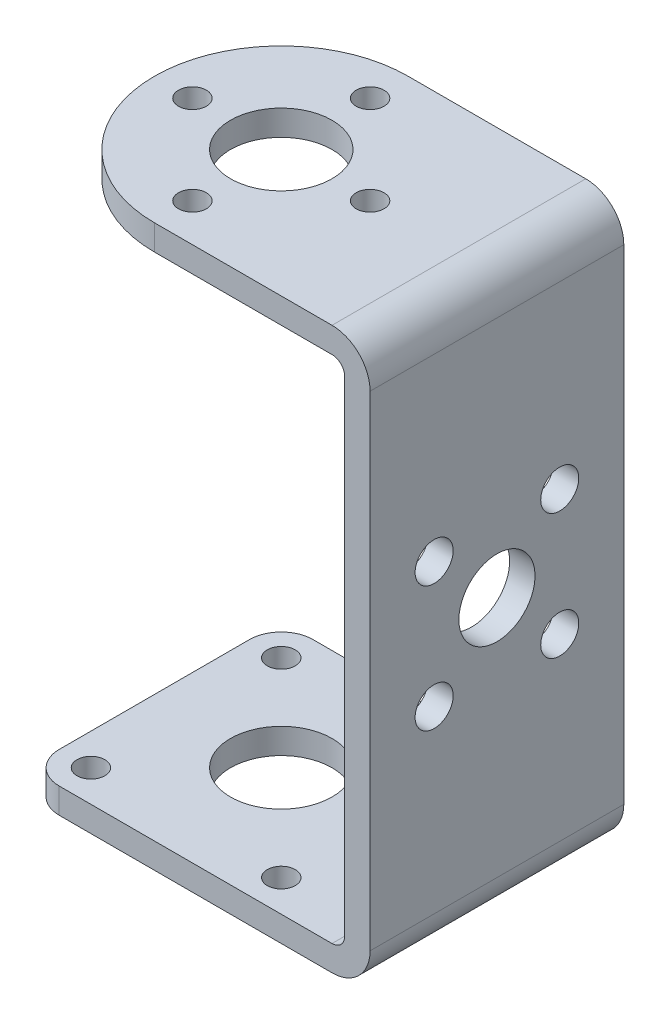
ISO-10303-21;
HEADER;
FILE_DESCRIPTION(('STEP AP214'),'2;1');
FILE_NAME('part.step','',(''),(''),'','','');
FILE_SCHEMA(('AUTOMOTIVE_DESIGN { 1 0 10303 214 1 1 1 1 }'));
ENDSEC;
DATA;
#1=APPLICATION_CONTEXT('core data for automotive mechanical design processes');
#2=APPLICATION_PROTOCOL_DEFINITION('international standard','automotive_design',2000,#1);
#3=PRODUCT_CONTEXT('',#1,'mechanical');
#4=PRODUCT('Part','Part','',(#3));
#5=PRODUCT_RELATED_PRODUCT_CATEGORY('part','',(#4));
#6=PRODUCT_DEFINITION_FORMATION('','',#4);
#7=PRODUCT_DEFINITION_CONTEXT('part definition',#1,'design');
#8=PRODUCT_DEFINITION('design','',#6,#7);
#9=PRODUCT_DEFINITION_SHAPE('','',#8);
#10=(LENGTH_UNIT() NAMED_UNIT(*) SI_UNIT(.MILLI.,.METRE.));
#11=(NAMED_UNIT(*) PLANE_ANGLE_UNIT() SI_UNIT($,.RADIAN.));
#12=(NAMED_UNIT(*) SI_UNIT($,.STERADIAN.) SOLID_ANGLE_UNIT());
#13=UNCERTAINTY_MEASURE_WITH_UNIT(LENGTH_MEASURE(1.E-05),#10,'distance_accuracy_value','');
#14=(GEOMETRIC_REPRESENTATION_CONTEXT(3) GLOBAL_UNCERTAINTY_ASSIGNED_CONTEXT((#13)) GLOBAL_UNIT_ASSIGNED_CONTEXT((#10,
#11,#12)) REPRESENTATION_CONTEXT('',''));
#15=CARTESIAN_POINT('',(0.,0.,0.));
#16=DIRECTION('',(0.,0.,1.));
#17=DIRECTION('',(1.,0.,0.));
#18=AXIS2_PLACEMENT_3D('',#15,#16,#17);
#19=CARTESIAN_POINT('',(0.,20.1,10.));
#20=DIRECTION('',(0.,1.,0.));
#21=DIRECTION('',(-1.,0.,0.));
#22=AXIS2_PLACEMENT_3D('',#19,#20,#21);
#23=PLANE('',#22);
#24=CARTESIAN_POINT('',(0.,20.1,7.));
#25=DIRECTION('',(0.,-1.,0.));
#26=DIRECTION('',(0.,0.,-1.));
#27=AXIS2_PLACEMENT_3D('',#24,#25,#26);
#28=CIRCLE('',#27,1.09999999999999);
#29=CARTESIAN_POINT('',(0.,20.1,5.90000000000001));
#30=VERTEX_POINT('',#29);
#31=EDGE_CURVE('E309',#30,#30,#28,.T.);
#32=ORIENTED_EDGE('',*,*,#31,.F.);
#33=EDGE_LOOP('',(#32));
#34=FACE_BOUND('',#33,.T.);
#35=CARTESIAN_POINT('',(0.,20.1,0.));
#36=DIRECTION('',(0.,-1.,0.));
#37=DIRECTION('',(0.,0.,-1.));
#38=AXIS2_PLACEMENT_3D('',#35,#36,#37);
#39=CIRCLE('',#38,3.99999999999999);
#40=CARTESIAN_POINT('',(0.,20.1,-3.99999999999999));
#41=VERTEX_POINT('',#40);
#42=EDGE_CURVE('E318',#41,#41,#39,.T.);
#43=ORIENTED_EDGE('',*,*,#42,.F.);
#44=EDGE_LOOP('',(#43));
#45=FACE_BOUND('',#44,.T.);
#46=CARTESIAN_POINT('',(0.,20.1,-7.));
#47=DIRECTION('',(0.,-1.,0.));
#48=DIRECTION('',(0.,0.,-1.));
#49=AXIS2_PLACEMENT_3D('',#46,#47,#48);
#50=CIRCLE('',#49,1.09999999999999);
#51=CARTESIAN_POINT('',(0.,20.1,-8.09999999999999));
#52=VERTEX_POINT('',#51);
#53=EDGE_CURVE('E321',#52,#52,#50,.T.);
#54=ORIENTED_EDGE('',*,*,#53,.F.);
#55=EDGE_LOOP('',(#54));
#56=FACE_BOUND('',#55,.T.);
#57=CARTESIAN_POINT('',(7.,20.1,0.));
#58=DIRECTION('',(0.,-1.,0.));
#59=DIRECTION('',(0.,0.,-1.));
#60=AXIS2_PLACEMENT_3D('',#57,#58,#59);
#61=CIRCLE('',#60,1.09999999999999);
#62=CARTESIAN_POINT('',(7.,20.1,-1.09999999999999));
#63=VERTEX_POINT('',#62);
#64=EDGE_CURVE('E303',#63,#63,#61,.T.);
#65=ORIENTED_EDGE('',*,*,#64,.F.);
#66=EDGE_LOOP('',(#65));
#67=FACE_BOUND('',#66,.T.);
#68=DIRECTION('',(1.,0.,0.));
#69=VECTOR('',#68,1.);
#70=CARTESIAN_POINT('',(0.,20.1,-10.));
#71=LINE('',#70,#69);
#72=CARTESIAN_POINT('',(0.,20.1,-10.));
#73=VERTEX_POINT('',#72);
#74=CARTESIAN_POINT('',(14.,20.1,-10.));
#75=VERTEX_POINT('',#74);
#76=EDGE_CURVE('E251',#73,#75,#71,.T.);
#77=ORIENTED_EDGE('',*,*,#76,.T.);
#78=DIRECTION('',(0.,0.,-1.));
#79=VECTOR('',#78,1.);
#80=CARTESIAN_POINT('',(14.,20.1,10.));
#81=LINE('',#80,#79);
#82=CARTESIAN_POINT('',(14.,20.1,10.));
#83=VERTEX_POINT('',#82);
#84=EDGE_CURVE('E155',#75,#83,#81,.F.);
#85=ORIENTED_EDGE('',*,*,#84,.T.);
#86=DIRECTION('',(1.,0.,0.));
#87=VECTOR('',#86,1.);
#88=CARTESIAN_POINT('',(0.,20.1,10.));
#89=LINE('',#88,#87);
#90=CARTESIAN_POINT('',(0.,20.1,10.));
#91=VERTEX_POINT('',#90);
#92=EDGE_CURVE('E152',#91,#83,#89,.T.);
#93=ORIENTED_EDGE('',*,*,#92,.F.);
#94=CARTESIAN_POINT('',(0.,20.1,0.));
#95=DIRECTION('',(0.,1.,0.));
#96=DIRECTION('',(0.,0.,1.));
#97=AXIS2_PLACEMENT_3D('',#94,#95,#96);
#98=CIRCLE('',#97,10.);
#99=EDGE_CURVE('E137',#91,#73,#98,.F.);
#100=ORIENTED_EDGE('',*,*,#99,.T.);
#101=EDGE_LOOP('',(#77,#85,#93,#100));
#102=FACE_BOUND('',#101,.T.);
#103=CARTESIAN_POINT('',(-7.,20.1,0.));
#104=DIRECTION('',(0.,-1.,0.));
#105=DIRECTION('',(0.,0.,-1.));
#106=AXIS2_PLACEMENT_3D('',#103,#104,#105);
#107=CIRCLE('',#106,1.09999999999999);
#108=CARTESIAN_POINT('',(-7.,20.1,-1.09999999999999));
#109=VERTEX_POINT('',#108);
#110=EDGE_CURVE('E148',#109,#109,#107,.T.);
#111=ORIENTED_EDGE('',*,*,#110,.F.);
#112=EDGE_LOOP('',(#111));
#113=FACE_BOUND('',#112,.T.);
#114=ADVANCED_FACE('F32',(#34,#45,#56,#67,#102,#113),#23,.F.);
#115=CARTESIAN_POINT('',(0.,22.1,0.));
#116=DIRECTION('',(0.,-1.,0.));
#117=DIRECTION('',(0.,0.,-1.));
#118=AXIS2_PLACEMENT_3D('',#115,#116,#117);
#119=CYLINDRICAL_SURFACE('',#118,10.);
#120=ORIENTED_EDGE('',*,*,#99,.F.);
#121=DIRECTION('',(0.,-1.,0.));
#122=VECTOR('',#121,1.);
#123=CARTESIAN_POINT('',(0.,22.1,10.));
#124=LINE('',#123,#122);
#125=CARTESIAN_POINT('',(0.,22.1,10.));
#126=VERTEX_POINT('',#125);
#127=EDGE_CURVE('E142',#126,#91,#124,.T.);
#128=ORIENTED_EDGE('',*,*,#127,.F.);
#129=CARTESIAN_POINT('',(0.,22.1,0.));
#130=DIRECTION('',(0.,-1.,0.));
#131=DIRECTION('',(0.,0.,-1.));
#132=AXIS2_PLACEMENT_3D('',#129,#130,#131);
#133=CIRCLE('',#132,10.);
#134=CARTESIAN_POINT('',(0.,22.1,-10.));
#135=VERTEX_POINT('',#134);
#136=EDGE_CURVE('E234',#126,#135,#133,.T.);
#137=ORIENTED_EDGE('',*,*,#136,.T.);
#138=DIRECTION('',(0.,-1.,0.));
#139=VECTOR('',#138,1.);
#140=CARTESIAN_POINT('',(0.,22.1,-10.));
#141=LINE('',#140,#139);
#142=EDGE_CURVE('E144',#135,#73,#141,.T.);
#143=ORIENTED_EDGE('',*,*,#142,.T.);
#144=EDGE_LOOP('',(#120,#128,#137,#143));
#145=FACE_BOUND('',#144,.T.);
#146=ADVANCED_FACE('F139',(#145),#119,.T.);
#147=CARTESIAN_POINT('',(15.,20.1,10.));
#148=DIRECTION('',(1.,0.,0.));
#149=DIRECTION('',(0.,1.,0.));
#150=AXIS2_PLACEMENT_3D('',#147,#148,#149);
#151=PLANE('',#150);
#152=CARTESIAN_POINT('',(15.,0.,0.));
#153=DIRECTION('',(-1.,0.,0.));
#154=DIRECTION('',(0.,0.,1.));
#155=AXIS2_PLACEMENT_3D('',#152,#153,#154);
#156=CIRCLE('',#155,2.99999999999999);
#157=CARTESIAN_POINT('',(15.,0.,2.99999999999999));
#158=VERTEX_POINT('',#157);
#159=EDGE_CURVE('E294',#158,#158,#156,.T.);
#160=ORIENTED_EDGE('',*,*,#159,.F.);
#161=EDGE_LOOP('',(#160));
#162=FACE_BOUND('',#161,.T.);
#163=CARTESIAN_POINT('',(15.,4.949747468306,4.949747468306));
#164=DIRECTION('',(-1.,0.,0.));
#165=DIRECTION('',(0.,0.,1.));
#166=AXIS2_PLACEMENT_3D('',#163,#164,#165);
#167=CIRCLE('',#166,1.49999999999999);
#168=CARTESIAN_POINT('',(15.,4.949747468306,6.44974746830599));
#169=VERTEX_POINT('',#168);
#170=EDGE_CURVE('E288',#169,#169,#167,.T.);
#171=ORIENTED_EDGE('',*,*,#170,.F.);
#172=EDGE_LOOP('',(#171));
#173=FACE_BOUND('',#172,.T.);
#174=CARTESIAN_POINT('',(15.,-4.949747468306,4.949747468306));
#175=DIRECTION('',(-1.,0.,0.));
#176=DIRECTION('',(0.,0.,1.));
#177=AXIS2_PLACEMENT_3D('',#174,#175,#176);
#178=CIRCLE('',#177,1.49999999999999);
#179=CARTESIAN_POINT('',(15.,-4.949747468306,6.44974746830599));
#180=VERTEX_POINT('',#179);
#181=EDGE_CURVE('E282',#180,#180,#178,.T.);
#182=ORIENTED_EDGE('',*,*,#181,.F.);
#183=EDGE_LOOP('',(#182));
#184=FACE_BOUND('',#183,.T.);
#185=CARTESIAN_POINT('',(15.,-4.949747468306,-4.949747468306));
#186=DIRECTION('',(-1.,0.,0.));
#187=DIRECTION('',(0.,0.,1.));
#188=AXIS2_PLACEMENT_3D('',#185,#186,#187);
#189=CIRCLE('',#188,1.49999999999999);
#190=CARTESIAN_POINT('',(15.,-4.949747468306,-3.44974746830601));
#191=VERTEX_POINT('',#190);
#192=EDGE_CURVE('E276',#191,#191,#189,.T.);
#193=ORIENTED_EDGE('',*,*,#192,.F.);
#194=EDGE_LOOP('',(#193));
#195=FACE_BOUND('',#194,.T.);
#196=CARTESIAN_POINT('',(15.,4.949747468306,-4.949747468306));
#197=DIRECTION('',(-1.,0.,0.));
#198=DIRECTION('',(0.,0.,1.));
#199=AXIS2_PLACEMENT_3D('',#196,#197,#198);
#200=CIRCLE('',#199,1.49999999999999);
#201=CARTESIAN_POINT('',(15.,4.949747468306,-3.44974746830601));
#202=VERTEX_POINT('',#201);
#203=EDGE_CURVE('E270',#202,#202,#200,.T.);
#204=ORIENTED_EDGE('',*,*,#203,.F.);
#205=EDGE_LOOP('',(#204));
#206=FACE_BOUND('',#205,.T.);
#207=DIRECTION('',(0.,-1.,0.));
#208=VECTOR('',#207,1.);
#209=CARTESIAN_POINT('',(15.,20.1,-10.));
#210=LINE('',#209,#208);
#211=CARTESIAN_POINT('',(15.,19.1,-10.));
#212=VERTEX_POINT('',#211);
#213=CARTESIAN_POINT('',(15.,-19.1,-10.));
#214=VERTEX_POINT('',#213);
#215=EDGE_CURVE('E159',#212,#214,#210,.T.);
#216=ORIENTED_EDGE('',*,*,#215,.T.);
#217=DIRECTION('',(0.,0.,-1.));
#218=VECTOR('',#217,1.);
#219=CARTESIAN_POINT('',(15.,-19.1,10.));
#220=LINE('',#219,#218);
#221=CARTESIAN_POINT('',(15.,-19.1,10.));
#222=VERTEX_POINT('',#221);
#223=EDGE_CURVE('E182',#214,#222,#220,.F.);
#224=ORIENTED_EDGE('',*,*,#223,.T.);
#225=DIRECTION('',(0.,-1.,0.));
#226=VECTOR('',#225,1.);
#227=CARTESIAN_POINT('',(15.,20.1,10.));
#228=LINE('',#227,#226);
#229=CARTESIAN_POINT('',(15.,19.1,10.));
#230=VERTEX_POINT('',#229);
#231=EDGE_CURVE('E158',#230,#222,#228,.T.);
#232=ORIENTED_EDGE('',*,*,#231,.F.);
#233=DIRECTION('',(0.,0.,-1.));
#234=VECTOR('',#233,1.);
#235=CARTESIAN_POINT('',(15.,19.1,-10.));
#236=LINE('',#235,#234);
#237=EDGE_CURVE('E179',#230,#212,#236,.T.);
#238=ORIENTED_EDGE('',*,*,#237,.T.);
#239=EDGE_LOOP('',(#216,#224,#232,#238));
#240=FACE_BOUND('',#239,.T.);
#241=ADVANCED_FACE('F388',(#162,#173,#184,#195,#206,#240),#151,.F.);
#242=CARTESIAN_POINT('',(17.,22.1,-10.));
#243=DIRECTION('',(1.,0.,0.));
#244=DIRECTION('',(0.,0.,-1.));
#245=AXIS2_PLACEMENT_3D('',#242,#243,#244);
#246=PLANE('',#245);
#247=CARTESIAN_POINT('',(17.,0.,0.));
#248=DIRECTION('',(-1.,0.,0.));
#249=DIRECTION('',(0.,0.,1.));
#250=AXIS2_PLACEMENT_3D('',#247,#248,#249);
#251=CIRCLE('',#250,2.99999999999999);
#252=CARTESIAN_POINT('',(17.,0.,2.99999999999999));
#253=VERTEX_POINT('',#252);
#254=EDGE_CURVE('E291',#253,#253,#251,.T.);
#255=ORIENTED_EDGE('',*,*,#254,.T.);
#256=EDGE_LOOP('',(#255));
#257=FACE_BOUND('',#256,.T.);
#258=CARTESIAN_POINT('',(17.,4.949747468306,4.949747468306));
#259=DIRECTION('',(-1.,0.,0.));
#260=DIRECTION('',(0.,0.,1.));
#261=AXIS2_PLACEMENT_3D('',#258,#259,#260);
#262=CIRCLE('',#261,1.49999999999999);
#263=CARTESIAN_POINT('',(17.,4.949747468306,6.44974746830599));
#264=VERTEX_POINT('',#263);
#265=EDGE_CURVE('E285',#264,#264,#262,.T.);
#266=ORIENTED_EDGE('',*,*,#265,.T.);
#267=EDGE_LOOP('',(#266));
#268=FACE_BOUND('',#267,.T.);
#269=CARTESIAN_POINT('',(17.,-4.949747468306,4.949747468306));
#270=DIRECTION('',(-1.,0.,0.));
#271=DIRECTION('',(0.,0.,1.));
#272=AXIS2_PLACEMENT_3D('',#269,#270,#271);
#273=CIRCLE('',#272,1.49999999999999);
#274=CARTESIAN_POINT('',(17.,-4.949747468306,6.44974746830599));
#275=VERTEX_POINT('',#274);
#276=EDGE_CURVE('E279',#275,#275,#273,.T.);
#277=ORIENTED_EDGE('',*,*,#276,.T.);
#278=EDGE_LOOP('',(#277));
#279=FACE_BOUND('',#278,.T.);
#280=CARTESIAN_POINT('',(17.,-4.949747468306,-4.949747468306));
#281=DIRECTION('',(-1.,0.,0.));
#282=DIRECTION('',(0.,0.,1.));
#283=AXIS2_PLACEMENT_3D('',#280,#281,#282);
#284=CIRCLE('',#283,1.49999999999999);
#285=CARTESIAN_POINT('',(17.,-4.949747468306,-3.44974746830601));
#286=VERTEX_POINT('',#285);
#287=EDGE_CURVE('E273',#286,#286,#284,.T.);
#288=ORIENTED_EDGE('',*,*,#287,.T.);
#289=EDGE_LOOP('',(#288));
#290=FACE_BOUND('',#289,.T.);
#291=CARTESIAN_POINT('',(17.,4.949747468306,-4.949747468306));
#292=DIRECTION('',(-1.,0.,0.));
#293=DIRECTION('',(0.,0.,1.));
#294=AXIS2_PLACEMENT_3D('',#291,#292,#293);
#295=CIRCLE('',#294,1.49999999999999);
#296=CARTESIAN_POINT('',(17.,4.949747468306,-3.44974746830601));
#297=VERTEX_POINT('',#296);
#298=EDGE_CURVE('E267',#297,#297,#295,.T.);
#299=ORIENTED_EDGE('',*,*,#298,.T.);
#300=EDGE_LOOP('',(#299));
#301=FACE_BOUND('',#300,.T.);
#302=DIRECTION('',(0.,-1.,0.));
#303=VECTOR('',#302,1.);
#304=CARTESIAN_POINT('',(17.,22.1,-10.));
#305=LINE('',#304,#303);
#306=CARTESIAN_POINT('',(17.,19.1,-10.));
#307=VERTEX_POINT('',#306);
#308=CARTESIAN_POINT('',(17.,-19.1,-10.));
#309=VERTEX_POINT('',#308);
#310=EDGE_CURVE('E166',#307,#309,#305,.T.);
#311=ORIENTED_EDGE('',*,*,#310,.F.);
#312=DIRECTION('',(0.,0.,1.));
#313=VECTOR('',#312,1.);
#314=CARTESIAN_POINT('',(17.,19.1,10.));
#315=LINE('',#314,#313);
#316=CARTESIAN_POINT('',(17.,19.1,10.));
#317=VERTEX_POINT('',#316);
#318=EDGE_CURVE('E216',#307,#317,#315,.T.);
#319=ORIENTED_EDGE('',*,*,#318,.T.);
#320=DIRECTION('',(0.,-1.,0.));
#321=VECTOR('',#320,1.);
#322=CARTESIAN_POINT('',(17.,22.1,10.));
#323=LINE('',#322,#321);
#324=CARTESIAN_POINT('',(17.,-19.1,10.));
#325=VERTEX_POINT('',#324);
#326=EDGE_CURVE('E164',#317,#325,#323,.T.);
#327=ORIENTED_EDGE('',*,*,#326,.T.);
#328=DIRECTION('',(0.,0.,1.));
#329=VECTOR('',#328,1.);
#330=CARTESIAN_POINT('',(17.,-19.1,-10.));
#331=LINE('',#330,#329);
#332=EDGE_CURVE('E214',#325,#309,#331,.F.);
#333=ORIENTED_EDGE('',*,*,#332,.T.);
#334=EDGE_LOOP('',(#311,#319,#327,#333));
#335=FACE_BOUND('',#334,.T.);
#336=ADVANCED_FACE('F230',(#257,#268,#279,#290,#301,#335),#246,.T.);
#337=CARTESIAN_POINT('',(0.,22.1,-10.));
#338=DIRECTION('',(0.,0.,-1.));
#339=DIRECTION('',(-1.,0.,0.));
#340=AXIS2_PLACEMENT_3D('',#337,#338,#339);
#341=PLANE('',#340);
#342=DIRECTION('',(1.,0.,0.));
#343=VECTOR('',#342,1.);
#344=CARTESIAN_POINT('',(0.,22.1,-10.));
#345=LINE('',#344,#343);
#346=CARTESIAN_POINT('',(14.,22.1,-10.));
#347=VERTEX_POINT('',#346);
#348=EDGE_CURVE('E169',#135,#347,#345,.T.);
#349=ORIENTED_EDGE('',*,*,#348,.T.);
#350=CARTESIAN_POINT('',(14.,19.1,-10.));
#351=DIRECTION('',(0.,0.,-1.));
#352=DIRECTION('',(-1.,0.,0.));
#353=AXIS2_PLACEMENT_3D('',#350,#351,#352);
#354=CIRCLE('',#353,3.);
#355=EDGE_CURVE('E40',#347,#307,#354,.T.);
#356=ORIENTED_EDGE('',*,*,#355,.T.);
#357=ORIENTED_EDGE('',*,*,#310,.T.);
#358=CARTESIAN_POINT('',(14.,-19.1,-10.));
#359=DIRECTION('',(0.,0.,-1.));
#360=DIRECTION('',(-1.,0.,0.));
#361=AXIS2_PLACEMENT_3D('',#358,#359,#360);
#362=CIRCLE('',#361,3.);
#363=CARTESIAN_POINT('',(14.,-22.1,-10.));
#364=VERTEX_POINT('',#363);
#365=EDGE_CURVE('E47',#309,#364,#362,.T.);
#366=ORIENTED_EDGE('',*,*,#365,.T.);
#367=DIRECTION('',(1.,0.,0.));
#368=VECTOR('',#367,1.);
#369=CARTESIAN_POINT('',(0.,-22.1,-10.));
#370=LINE('',#369,#368);
#371=CARTESIAN_POINT('',(-7.5,-22.1,-10.));
#372=VERTEX_POINT('',#371);
#373=EDGE_CURVE('E235',#372,#364,#370,.T.);
#374=ORIENTED_EDGE('',*,*,#373,.F.);
#375=DIRECTION('',(0.,-1.,0.));
#376=VECTOR('',#375,1.);
#377=CARTESIAN_POINT('',(-7.5,-20.1,-10.));
#378=LINE('',#377,#376);
#379=CARTESIAN_POINT('',(-7.5,-20.1,-10.));
#380=VERTEX_POINT('',#379);
#381=EDGE_CURVE('E203',#372,#380,#378,.F.);
#382=ORIENTED_EDGE('',*,*,#381,.T.);
#383=DIRECTION('',(1.,0.,0.));
#384=VECTOR('',#383,1.);
#385=CARTESIAN_POINT('',(-10.,-20.1,-10.));
#386=LINE('',#385,#384);
#387=CARTESIAN_POINT('',(14.,-20.1,-10.));
#388=VERTEX_POINT('',#387);
#389=EDGE_CURVE('E255',#380,#388,#386,.T.);
#390=ORIENTED_EDGE('',*,*,#389,.T.);
#391=CARTESIAN_POINT('',(14.,-19.1,-10.));
#392=DIRECTION('',(0.,0.,-1.));
#393=DIRECTION('',(-1.,0.,0.));
#394=AXIS2_PLACEMENT_3D('',#391,#392,#393);
#395=CIRCLE('',#394,1.);
#396=EDGE_CURVE('E185',#388,#214,#395,.F.);
#397=ORIENTED_EDGE('',*,*,#396,.T.);
#398=ORIENTED_EDGE('',*,*,#215,.F.);
#399=CARTESIAN_POINT('',(14.,19.1,-10.));
#400=DIRECTION('',(0.,0.,-1.));
#401=DIRECTION('',(-1.,0.,0.));
#402=AXIS2_PLACEMENT_3D('',#399,#400,#401);
#403=CIRCLE('',#402,1.);
#404=EDGE_CURVE('E189',#212,#75,#403,.F.);
#405=ORIENTED_EDGE('',*,*,#404,.T.);
#406=ORIENTED_EDGE('',*,*,#76,.F.);
#407=ORIENTED_EDGE('',*,*,#142,.F.);
#408=EDGE_LOOP('',(#349,#356,#357,#366,#374,#382,#390,#397,#398,#405,#406,#407));
#409=FACE_BOUND('',#408,.T.);
#410=ADVANCED_FACE('F226',(#409),#341,.T.);
#411=CARTESIAN_POINT('',(17.,22.1,10.));
#412=DIRECTION('',(0.,0.,1.));
#413=DIRECTION('',(1.,0.,0.));
#414=AXIS2_PLACEMENT_3D('',#411,#412,#413);
#415=PLANE('',#414);
#416=ORIENTED_EDGE('',*,*,#326,.F.);
#417=CARTESIAN_POINT('',(14.,19.1,10.));
#418=DIRECTION('',(0.,0.,1.));
#419=DIRECTION('',(1.,0.,0.));
#420=AXIS2_PLACEMENT_3D('',#417,#418,#419);
#421=CIRCLE('',#420,3.);
#422=CARTESIAN_POINT('',(14.,22.1,10.));
#423=VERTEX_POINT('',#422);
#424=EDGE_CURVE('E221',#317,#423,#421,.T.);
#425=ORIENTED_EDGE('',*,*,#424,.T.);
#426=DIRECTION('',(-1.,0.,0.));
#427=VECTOR('',#426,1.);
#428=CARTESIAN_POINT('',(17.,22.1,10.));
#429=LINE('',#428,#427);
#430=EDGE_CURVE('E163',#423,#126,#429,.T.);
#431=ORIENTED_EDGE('',*,*,#430,.T.);
#432=ORIENTED_EDGE('',*,*,#127,.T.);
#433=ORIENTED_EDGE('',*,*,#92,.T.);
#434=CARTESIAN_POINT('',(14.,19.1,10.));
#435=DIRECTION('',(0.,0.,1.));
#436=DIRECTION('',(1.,0.,0.));
#437=AXIS2_PLACEMENT_3D('',#434,#435,#436);
#438=CIRCLE('',#437,1.);
#439=EDGE_CURVE('E191',#83,#230,#438,.F.);
#440=ORIENTED_EDGE('',*,*,#439,.T.);
#441=ORIENTED_EDGE('',*,*,#231,.T.);
#442=CARTESIAN_POINT('',(14.,-19.1,10.));
#443=DIRECTION('',(0.,0.,1.));
#444=DIRECTION('',(1.,0.,0.));
#445=AXIS2_PLACEMENT_3D('',#442,#443,#444);
#446=CIRCLE('',#445,1.);
#447=CARTESIAN_POINT('',(14.,-20.1,10.));
#448=VERTEX_POINT('',#447);
#449=EDGE_CURVE('E187',#222,#448,#446,.F.);
#450=ORIENTED_EDGE('',*,*,#449,.T.);
#451=DIRECTION('',(1.,0.,0.));
#452=VECTOR('',#451,1.);
#453=CARTESIAN_POINT('',(-10.,-20.1,10.));
#454=LINE('',#453,#452);
#455=CARTESIAN_POINT('',(-7.5,-20.1,10.));
#456=VERTEX_POINT('',#455);
#457=EDGE_CURVE('E252',#456,#448,#454,.T.);
#458=ORIENTED_EDGE('',*,*,#457,.F.);
#459=DIRECTION('',(0.,1.,0.));
#460=VECTOR('',#459,1.);
#461=CARTESIAN_POINT('',(-7.5,-22.1,10.));
#462=LINE('',#461,#460);
#463=CARTESIAN_POINT('',(-7.5,-22.1,10.));
#464=VERTEX_POINT('',#463);
#465=EDGE_CURVE('E211',#456,#464,#462,.F.);
#466=ORIENTED_EDGE('',*,*,#465,.T.);
#467=DIRECTION('',(-1.,0.,0.));
#468=VECTOR('',#467,1.);
#469=CARTESIAN_POINT('',(17.,-22.1,10.));
#470=LINE('',#469,#468);
#471=CARTESIAN_POINT('',(14.,-22.1,10.));
#472=VERTEX_POINT('',#471);
#473=EDGE_CURVE('E238',#472,#464,#470,.T.);
#474=ORIENTED_EDGE('',*,*,#473,.F.);
#475=CARTESIAN_POINT('',(14.,-19.1,10.));
#476=DIRECTION('',(0.,0.,1.));
#477=DIRECTION('',(1.,0.,0.));
#478=AXIS2_PLACEMENT_3D('',#475,#476,#477);
#479=CIRCLE('',#478,3.);
#480=EDGE_CURVE('E219',#472,#325,#479,.T.);
#481=ORIENTED_EDGE('',*,*,#480,.T.);
#482=EDGE_LOOP('',(#416,#425,#431,#432,#433,#440,#441,#450,#458,#466,#474,#481));
#483=FACE_BOUND('',#482,.T.);
#484=ADVANCED_FACE('F162',(#483),#415,.T.);
#485=CARTESIAN_POINT('',(0.,22.1,0.));
#486=DIRECTION('',(0.,-1.,0.));
#487=DIRECTION('',(0.,0.,-1.));
#488=AXIS2_PLACEMENT_3D('',#485,#486,#487);
#489=PLANE('',#488);
#490=CARTESIAN_POINT('',(0.,22.1,0.));
#491=DIRECTION('',(0.,-1.,0.));
#492=DIRECTION('',(0.,0.,-1.));
#493=AXIS2_PLACEMENT_3D('',#490,#491,#492);
#494=CIRCLE('',#493,3.99999999999999);
#495=CARTESIAN_POINT('',(0.,22.1,-3.99999999999999));
#496=VERTEX_POINT('',#495);
#497=EDGE_CURVE('E324',#496,#496,#494,.T.);
#498=ORIENTED_EDGE('',*,*,#497,.T.);
#499=EDGE_LOOP('',(#498));
#500=FACE_BOUND('',#499,.T.);
#501=CARTESIAN_POINT('',(0.,22.1,-7.));
#502=DIRECTION('',(0.,-1.,0.));
#503=DIRECTION('',(0.,0.,-1.));
#504=AXIS2_PLACEMENT_3D('',#501,#502,#503);
#505=CIRCLE('',#504,1.09999999999999);
#506=CARTESIAN_POINT('',(0.,22.1,-8.09999999999999));
#507=VERTEX_POINT('',#506);
#508=EDGE_CURVE('E315',#507,#507,#505,.T.);
#509=ORIENTED_EDGE('',*,*,#508,.T.);
#510=EDGE_LOOP('',(#509));
#511=FACE_BOUND('',#510,.T.);
#512=CARTESIAN_POINT('',(-7.,22.1,0.));
#513=DIRECTION('',(0.,-1.,0.));
#514=DIRECTION('',(0.,0.,-1.));
#515=AXIS2_PLACEMENT_3D('',#512,#513,#514);
#516=CIRCLE('',#515,1.09999999999999);
#517=CARTESIAN_POINT('',(-7.,22.1,-1.09999999999999));
#518=VERTEX_POINT('',#517);
#519=EDGE_CURVE('E312',#518,#518,#516,.T.);
#520=ORIENTED_EDGE('',*,*,#519,.T.);
#521=EDGE_LOOP('',(#520));
#522=FACE_BOUND('',#521,.T.);
#523=CARTESIAN_POINT('',(0.,22.1,7.));
#524=DIRECTION('',(0.,-1.,0.));
#525=DIRECTION('',(0.,0.,-1.));
#526=AXIS2_PLACEMENT_3D('',#523,#524,#525);
#527=CIRCLE('',#526,1.09999999999999);
#528=CARTESIAN_POINT('',(0.,22.1,5.90000000000001));
#529=VERTEX_POINT('',#528);
#530=EDGE_CURVE('E306',#529,#529,#527,.T.);
#531=ORIENTED_EDGE('',*,*,#530,.T.);
#532=EDGE_LOOP('',(#531));
#533=FACE_BOUND('',#532,.T.);
#534=CARTESIAN_POINT('',(7.,22.1,0.));
#535=DIRECTION('',(0.,-1.,0.));
#536=DIRECTION('',(0.,0.,-1.));
#537=AXIS2_PLACEMENT_3D('',#534,#535,#536);
#538=CIRCLE('',#537,1.09999999999999);
#539=CARTESIAN_POINT('',(7.,22.1,-1.09999999999999));
#540=VERTEX_POINT('',#539);
#541=EDGE_CURVE('E300',#540,#540,#538,.T.);
#542=ORIENTED_EDGE('',*,*,#541,.T.);
#543=EDGE_LOOP('',(#542));
#544=FACE_BOUND('',#543,.T.);
#545=ORIENTED_EDGE('',*,*,#430,.F.);
#546=DIRECTION('',(0.,0.,1.));
#547=VECTOR('',#546,1.);
#548=CARTESIAN_POINT('',(14.,22.1,-10.));
#549=LINE('',#548,#547);
#550=EDGE_CURVE('E55',#423,#347,#549,.F.);
#551=ORIENTED_EDGE('',*,*,#550,.T.);
#552=ORIENTED_EDGE('',*,*,#348,.F.);
#553=ORIENTED_EDGE('',*,*,#136,.F.);
#554=EDGE_LOOP('',(#545,#551,#552,#553));
#555=FACE_BOUND('',#554,.T.);
#556=ADVANCED_FACE('F233',(#500,#511,#522,#533,#544,#555),#489,.F.);
#557=CARTESIAN_POINT('',(-10.,0.,0.));
#558=DIRECTION('',(1.,0.,0.));
#559=DIRECTION('',(0.,1.,0.));
#560=AXIS2_PLACEMENT_3D('',#557,#558,#559);
#561=PLANE('',#560);
#562=DIRECTION('',(0.,0.,-1.));
#563=VECTOR('',#562,1.);
#564=CARTESIAN_POINT('',(-10.,-20.1,-10.));
#565=LINE('',#564,#563);
#566=CARTESIAN_POINT('',(-10.,-20.1,7.5));
#567=VERTEX_POINT('',#566);
#568=CARTESIAN_POINT('',(-10.,-20.1,-7.5));
#569=VERTEX_POINT('',#568);
#570=EDGE_CURVE('E264',#567,#569,#565,.T.);
#571=ORIENTED_EDGE('',*,*,#570,.T.);
#572=DIRECTION('',(0.,-1.,0.));
#573=VECTOR('',#572,1.);
#574=CARTESIAN_POINT('',(-10.,-22.1,-7.5));
#575=LINE('',#574,#573);
#576=CARTESIAN_POINT('',(-10.,-22.1,-7.5));
#577=VERTEX_POINT('',#576);
#578=EDGE_CURVE('E196',#569,#577,#575,.T.);
#579=ORIENTED_EDGE('',*,*,#578,.T.);
#580=DIRECTION('',(0.,0.,1.));
#581=VECTOR('',#580,1.);
#582=CARTESIAN_POINT('',(-10.,-22.1,10.));
#583=LINE('',#582,#581);
#584=CARTESIAN_POINT('',(-10.,-22.1,7.5));
#585=VERTEX_POINT('',#584);
#586=EDGE_CURVE('E259',#577,#585,#583,.T.);
#587=ORIENTED_EDGE('',*,*,#586,.T.);
#588=DIRECTION('',(0.,1.,0.));
#589=VECTOR('',#588,1.);
#590=CARTESIAN_POINT('',(-10.,-20.1,7.5));
#591=LINE('',#590,#589);
#592=EDGE_CURVE('E193',#585,#567,#591,.T.);
#593=ORIENTED_EDGE('',*,*,#592,.T.);
#594=EDGE_LOOP('',(#571,#579,#587,#593));
#595=FACE_BOUND('',#594,.T.);
#596=ADVANCED_FACE('F377',(#595),#561,.F.);
#597=CARTESIAN_POINT('',(-10.,-20.1,-10.));
#598=DIRECTION('',(0.,-1.,0.));
#599=DIRECTION('',(1.,0.,0.));
#600=AXIS2_PLACEMENT_3D('',#597,#598,#599);
#601=PLANE('',#600);
#602=CARTESIAN_POINT('',(7.5,-20.1,-7.5));
#603=DIRECTION('',(0.,-1.,0.));
#604=DIRECTION('',(1.,0.,0.));
#605=AXIS2_PLACEMENT_3D('',#602,#603,#604);
#606=CIRCLE('',#605,1.1);
#607=CARTESIAN_POINT('',(8.6,-20.1,-7.5));
#608=VERTEX_POINT('',#607);
#609=EDGE_CURVE('E149',#608,#608,#606,.T.);
#610=ORIENTED_EDGE('',*,*,#609,.T.);
#611=EDGE_LOOP('',(#610));
#612=FACE_BOUND('',#611,.T.);
#613=CARTESIAN_POINT('',(7.5,-20.1,7.5));
#614=DIRECTION('',(0.,-1.,0.));
#615=DIRECTION('',(1.,0.,0.));
#616=AXIS2_PLACEMENT_3D('',#613,#614,#615);
#617=CIRCLE('',#616,1.1);
#618=CARTESIAN_POINT('',(8.6,-20.1,7.5));
#619=VERTEX_POINT('',#618);
#620=EDGE_CURVE('E331',#619,#619,#617,.T.);
#621=ORIENTED_EDGE('',*,*,#620,.T.);
#622=EDGE_LOOP('',(#621));
#623=FACE_BOUND('',#622,.T.);
#624=CARTESIAN_POINT('',(-7.5,-20.1,7.5));
#625=DIRECTION('',(0.,-1.,0.));
#626=DIRECTION('',(1.,0.,0.));
#627=AXIS2_PLACEMENT_3D('',#624,#625,#626);
#628=CIRCLE('',#627,1.1);
#629=CARTESIAN_POINT('',(-6.4,-20.1,7.5));
#630=VERTEX_POINT('',#629);
#631=EDGE_CURVE('E334',#630,#630,#628,.T.);
#632=ORIENTED_EDGE('',*,*,#631,.T.);
#633=EDGE_LOOP('',(#632));
#634=FACE_BOUND('',#633,.T.);
#635=CARTESIAN_POINT('',(-7.5,-20.1,-7.5));
#636=DIRECTION('',(0.,-1.,0.));
#637=DIRECTION('',(1.,0.,0.));
#638=AXIS2_PLACEMENT_3D('',#635,#636,#637);
#639=CIRCLE('',#638,1.1);
#640=CARTESIAN_POINT('',(-6.4,-20.1,-7.5));
#641=VERTEX_POINT('',#640);
#642=EDGE_CURVE('E337',#641,#641,#639,.T.);
#643=ORIENTED_EDGE('',*,*,#642,.T.);
#644=EDGE_LOOP('',(#643));
#645=FACE_BOUND('',#644,.T.);
#646=ORIENTED_EDGE('',*,*,#389,.F.);
#647=CARTESIAN_POINT('',(-7.5,-20.1,-7.5));
#648=DIRECTION('',(0.,-1.,0.));
#649=DIRECTION('',(1.,0.,0.));
#650=AXIS2_PLACEMENT_3D('',#647,#648,#649);
#651=CIRCLE('',#650,2.5);
#652=EDGE_CURVE('E206',#380,#569,#651,.F.);
#653=ORIENTED_EDGE('',*,*,#652,.T.);
#654=ORIENTED_EDGE('',*,*,#570,.F.);
#655=CARTESIAN_POINT('',(-7.5,-20.1,7.5));
#656=DIRECTION('',(0.,-1.,0.));
#657=DIRECTION('',(1.,0.,0.));
#658=AXIS2_PLACEMENT_3D('',#655,#656,#657);
#659=CIRCLE('',#658,2.5);
#660=EDGE_CURVE('E208',#567,#456,#659,.F.);
#661=ORIENTED_EDGE('',*,*,#660,.T.);
#662=ORIENTED_EDGE('',*,*,#457,.T.);
#663=DIRECTION('',(0.,0.,-1.));
#664=VECTOR('',#663,1.);
#665=CARTESIAN_POINT('',(14.,-20.1,-10.));
#666=LINE('',#665,#664);
#667=EDGE_CURVE('E176',#448,#388,#666,.T.);
#668=ORIENTED_EDGE('',*,*,#667,.T.);
#669=EDGE_LOOP('',(#646,#653,#654,#661,#662,#668));
#670=FACE_BOUND('',#669,.T.);
#671=CARTESIAN_POINT('',(0.,-20.1,0.));
#672=DIRECTION('',(0.,-1.,0.));
#673=DIRECTION('',(1.,0.,0.));
#674=AXIS2_PLACEMENT_3D('',#671,#672,#673);
#675=CIRCLE('',#674,3.99999999999999);
#676=CARTESIAN_POINT('',(3.99999999999999,-20.1,0.));
#677=VERTEX_POINT('',#676);
#678=EDGE_CURVE('E173',#677,#677,#675,.T.);
#679=ORIENTED_EDGE('',*,*,#678,.T.);
#680=EDGE_LOOP('',(#679));
#681=FACE_BOUND('',#680,.T.);
#682=ADVANCED_FACE('F360',(#612,#623,#634,#645,#670,#681),#601,.F.);
#683=CARTESIAN_POINT('',(0.,-22.1,0.));
#684=DIRECTION('',(0.,-1.,0.));
#685=DIRECTION('',(0.,0.,-1.));
#686=AXIS2_PLACEMENT_3D('',#683,#684,#685);
#687=PLANE('',#686);
#688=CARTESIAN_POINT('',(7.5,-22.1,-7.5));
#689=DIRECTION('',(0.,-1.,0.));
#690=DIRECTION('',(0.,0.,1.));
#691=AXIS2_PLACEMENT_3D('',#688,#689,#690);
#692=CIRCLE('',#691,1.1);
#693=CARTESIAN_POINT('',(7.5,-22.1,-6.4));
#694=VERTEX_POINT('',#693);
#695=EDGE_CURVE('E344',#694,#694,#692,.T.);
#696=ORIENTED_EDGE('',*,*,#695,.F.);
#697=EDGE_LOOP('',(#696));
#698=FACE_BOUND('',#697,.T.);
#699=CARTESIAN_POINT('',(7.5,-22.1,7.5));
#700=DIRECTION('',(0.,-1.,0.));
#701=DIRECTION('',(0.,0.,-1.));
#702=AXIS2_PLACEMENT_3D('',#699,#700,#701);
#703=CIRCLE('',#702,1.1);
#704=CARTESIAN_POINT('',(7.5,-22.1,6.4));
#705=VERTEX_POINT('',#704);
#706=EDGE_CURVE('E347',#705,#705,#703,.T.);
#707=ORIENTED_EDGE('',*,*,#706,.F.);
#708=EDGE_LOOP('',(#707));
#709=FACE_BOUND('',#708,.T.);
#710=CARTESIAN_POINT('',(-7.5,-22.1,7.5));
#711=DIRECTION('',(0.,-1.,0.));
#712=DIRECTION('',(0.,0.,1.));
#713=AXIS2_PLACEMENT_3D('',#710,#711,#712);
#714=CIRCLE('',#713,1.1);
#715=CARTESIAN_POINT('',(-7.5,-22.1,8.6));
#716=VERTEX_POINT('',#715);
#717=EDGE_CURVE('E343',#716,#716,#714,.T.);
#718=ORIENTED_EDGE('',*,*,#717,.F.);
#719=EDGE_LOOP('',(#718));
#720=FACE_BOUND('',#719,.T.);
#721=CARTESIAN_POINT('',(-7.5,-22.1,-7.5));
#722=DIRECTION('',(0.,-1.,0.));
#723=DIRECTION('',(0.,0.,-1.));
#724=AXIS2_PLACEMENT_3D('',#721,#722,#723);
#725=CIRCLE('',#724,1.1);
#726=CARTESIAN_POINT('',(-7.5,-22.1,-8.6));
#727=VERTEX_POINT('',#726);
#728=EDGE_CURVE('E340',#727,#727,#725,.T.);
#729=ORIENTED_EDGE('',*,*,#728,.F.);
#730=EDGE_LOOP('',(#729));
#731=FACE_BOUND('',#730,.T.);
#732=CARTESIAN_POINT('',(0.,-22.1,0.));
#733=DIRECTION('',(0.,-1.,0.));
#734=DIRECTION('',(0.,0.,-1.));
#735=AXIS2_PLACEMENT_3D('',#732,#733,#734);
#736=CIRCLE('',#735,3.99999999999999);
#737=CARTESIAN_POINT('',(0.,-22.1,-3.99999999999999));
#738=VERTEX_POINT('',#737);
#739=EDGE_CURVE('E297',#738,#738,#736,.T.);
#740=ORIENTED_EDGE('',*,*,#739,.F.);
#741=EDGE_LOOP('',(#740));
#742=FACE_BOUND('',#741,.T.);
#743=ORIENTED_EDGE('',*,*,#373,.T.);
#744=DIRECTION('',(0.,0.,1.));
#745=VECTOR('',#744,1.);
#746=CARTESIAN_POINT('',(14.,-22.1,0.));
#747=LINE('',#746,#745);
#748=EDGE_CURVE('E11',#364,#472,#747,.T.);
#749=ORIENTED_EDGE('',*,*,#748,.T.);
#750=ORIENTED_EDGE('',*,*,#473,.T.);
#751=CARTESIAN_POINT('',(-7.5,-22.1,7.5));
#752=DIRECTION('',(0.,-1.,0.));
#753=DIRECTION('',(0.,0.,-1.));
#754=AXIS2_PLACEMENT_3D('',#751,#752,#753);
#755=CIRCLE('',#754,2.5);
#756=EDGE_CURVE('E199',#464,#585,#755,.T.);
#757=ORIENTED_EDGE('',*,*,#756,.T.);
#758=ORIENTED_EDGE('',*,*,#586,.F.);
#759=CARTESIAN_POINT('',(-7.5,-22.1,-7.5));
#760=DIRECTION('',(0.,-1.,0.));
#761=DIRECTION('',(0.,0.,-1.));
#762=AXIS2_PLACEMENT_3D('',#759,#760,#761);
#763=CIRCLE('',#762,2.5);
#764=EDGE_CURVE('E201',#577,#372,#763,.T.);
#765=ORIENTED_EDGE('',*,*,#764,.T.);
#766=EDGE_LOOP('',(#743,#749,#750,#757,#758,#765));
#767=FACE_BOUND('',#766,.T.);
#768=ADVANCED_FACE('F356',(#698,#709,#720,#731,#742,#767),#687,.T.);
#769=CARTESIAN_POINT('',(15.,4.949747468306,-4.949747468306));
#770=DIRECTION('',(-1.,0.,0.));
#771=DIRECTION('',(0.,0.,1.));
#772=AXIS2_PLACEMENT_3D('',#769,#770,#771);
#773=CYLINDRICAL_SURFACE('',#772,1.49999999999999);
#774=ORIENTED_EDGE('',*,*,#298,.F.);
#775=EDGE_LOOP('',(#774));
#776=FACE_BOUND('',#775,.T.);
#777=ORIENTED_EDGE('',*,*,#203,.T.);
#778=EDGE_LOOP('',(#777));
#779=FACE_BOUND('',#778,.T.);
#780=ADVANCED_FACE('F359',(#776,#779),#773,.F.);
#781=CARTESIAN_POINT('',(15.,-4.949747468306,-4.949747468306));
#782=DIRECTION('',(-1.,0.,0.));
#783=DIRECTION('',(0.,0.,1.));
#784=AXIS2_PLACEMENT_3D('',#781,#782,#783);
#785=CYLINDRICAL_SURFACE('',#784,1.49999999999999);
#786=ORIENTED_EDGE('',*,*,#287,.F.);
#787=EDGE_LOOP('',(#786));
#788=FACE_BOUND('',#787,.T.);
#789=ORIENTED_EDGE('',*,*,#192,.T.);
#790=EDGE_LOOP('',(#789));
#791=FACE_BOUND('',#790,.T.);
#792=ADVANCED_FACE('F438',(#788,#791),#785,.F.);
#793=CARTESIAN_POINT('',(15.,-4.949747468306,4.949747468306));
#794=DIRECTION('',(-1.,0.,0.));
#795=DIRECTION('',(0.,0.,1.));
#796=AXIS2_PLACEMENT_3D('',#793,#794,#795);
#797=CYLINDRICAL_SURFACE('',#796,1.49999999999999);
#798=ORIENTED_EDGE('',*,*,#276,.F.);
#799=EDGE_LOOP('',(#798));
#800=FACE_BOUND('',#799,.T.);
#801=ORIENTED_EDGE('',*,*,#181,.T.);
#802=EDGE_LOOP('',(#801));
#803=FACE_BOUND('',#802,.T.);
#804=ADVANCED_FACE('F445',(#800,#803),#797,.F.);
#805=CARTESIAN_POINT('',(15.,4.949747468306,4.949747468306));
#806=DIRECTION('',(-1.,0.,0.));
#807=DIRECTION('',(0.,0.,1.));
#808=AXIS2_PLACEMENT_3D('',#805,#806,#807);
#809=CYLINDRICAL_SURFACE('',#808,1.49999999999999);
#810=ORIENTED_EDGE('',*,*,#265,.F.);
#811=EDGE_LOOP('',(#810));
#812=FACE_BOUND('',#811,.T.);
#813=ORIENTED_EDGE('',*,*,#170,.T.);
#814=EDGE_LOOP('',(#813));
#815=FACE_BOUND('',#814,.T.);
#816=ADVANCED_FACE('F503',(#812,#815),#809,.F.);
#817=CARTESIAN_POINT('',(15.,0.,0.));
#818=DIRECTION('',(-1.,0.,0.));
#819=DIRECTION('',(0.,0.,1.));
#820=AXIS2_PLACEMENT_3D('',#817,#818,#819);
#821=CYLINDRICAL_SURFACE('',#820,2.99999999999999);
#822=ORIENTED_EDGE('',*,*,#254,.F.);
#823=EDGE_LOOP('',(#822));
#824=FACE_BOUND('',#823,.T.);
#825=ORIENTED_EDGE('',*,*,#159,.T.);
#826=EDGE_LOOP('',(#825));
#827=FACE_BOUND('',#826,.T.);
#828=ADVANCED_FACE('F499',(#824,#827),#821,.F.);
#829=CARTESIAN_POINT('',(0.,-22.1,0.));
#830=DIRECTION('',(0.,-1.,0.));
#831=DIRECTION('',(0.,0.,-1.));
#832=AXIS2_PLACEMENT_3D('',#829,#830,#831);
#833=CYLINDRICAL_SURFACE('',#832,3.99999999999999);
#834=ORIENTED_EDGE('',*,*,#678,.F.);
#835=EDGE_LOOP('',(#834));
#836=FACE_BOUND('',#835,.T.);
#837=ORIENTED_EDGE('',*,*,#739,.T.);
#838=EDGE_LOOP('',(#837));
#839=FACE_BOUND('',#838,.T.);
#840=ADVANCED_FACE('F495',(#836,#839),#833,.F.);
#841=CARTESIAN_POINT('',(7.,20.1,0.));
#842=DIRECTION('',(0.,-1.,0.));
#843=DIRECTION('',(0.,0.,-1.));
#844=AXIS2_PLACEMENT_3D('',#841,#842,#843);
#845=CYLINDRICAL_SURFACE('',#844,1.09999999999999);
#846=ORIENTED_EDGE('',*,*,#541,.F.);
#847=EDGE_LOOP('',(#846));
#848=FACE_BOUND('',#847,.T.);
#849=ORIENTED_EDGE('',*,*,#64,.T.);
#850=EDGE_LOOP('',(#849));
#851=FACE_BOUND('',#850,.T.);
#852=ADVANCED_FACE('F491',(#848,#851),#845,.F.);
#853=CARTESIAN_POINT('',(0.,20.1,7.));
#854=DIRECTION('',(0.,-1.,0.));
#855=DIRECTION('',(0.,0.,-1.));
#856=AXIS2_PLACEMENT_3D('',#853,#854,#855);
#857=CYLINDRICAL_SURFACE('',#856,1.09999999999999);
#858=ORIENTED_EDGE('',*,*,#530,.F.);
#859=EDGE_LOOP('',(#858));
#860=FACE_BOUND('',#859,.T.);
#861=ORIENTED_EDGE('',*,*,#31,.T.);
#862=EDGE_LOOP('',(#861));
#863=FACE_BOUND('',#862,.T.);
#864=ADVANCED_FACE('F487',(#860,#863),#857,.F.);
#865=CARTESIAN_POINT('',(-7.,20.1,0.));
#866=DIRECTION('',(0.,-1.,0.));
#867=DIRECTION('',(0.,0.,-1.));
#868=AXIS2_PLACEMENT_3D('',#865,#866,#867);
#869=CYLINDRICAL_SURFACE('',#868,1.09999999999999);
#870=ORIENTED_EDGE('',*,*,#519,.F.);
#871=EDGE_LOOP('',(#870));
#872=FACE_BOUND('',#871,.T.);
#873=ORIENTED_EDGE('',*,*,#110,.T.);
#874=EDGE_LOOP('',(#873));
#875=FACE_BOUND('',#874,.T.);
#876=ADVANCED_FACE('F483',(#872,#875),#869,.F.);
#877=CARTESIAN_POINT('',(0.,20.1,-7.));
#878=DIRECTION('',(0.,-1.,0.));
#879=DIRECTION('',(0.,0.,-1.));
#880=AXIS2_PLACEMENT_3D('',#877,#878,#879);
#881=CYLINDRICAL_SURFACE('',#880,1.09999999999999);
#882=ORIENTED_EDGE('',*,*,#508,.F.);
#883=EDGE_LOOP('',(#882));
#884=FACE_BOUND('',#883,.T.);
#885=ORIENTED_EDGE('',*,*,#53,.T.);
#886=EDGE_LOOP('',(#885));
#887=FACE_BOUND('',#886,.T.);
#888=ADVANCED_FACE('F479',(#884,#887),#881,.F.);
#889=CARTESIAN_POINT('',(0.,20.1,0.));
#890=DIRECTION('',(0.,-1.,0.));
#891=DIRECTION('',(0.,0.,-1.));
#892=AXIS2_PLACEMENT_3D('',#889,#890,#891);
#893=CYLINDRICAL_SURFACE('',#892,3.99999999999999);
#894=ORIENTED_EDGE('',*,*,#497,.F.);
#895=EDGE_LOOP('',(#894));
#896=FACE_BOUND('',#895,.T.);
#897=ORIENTED_EDGE('',*,*,#42,.T.);
#898=EDGE_LOOP('',(#897));
#899=FACE_BOUND('',#898,.T.);
#900=ADVANCED_FACE('F399',(#896,#899),#893,.F.);
#901=CARTESIAN_POINT('',(14.,-19.1,-10.));
#902=DIRECTION('',(0.,0.,1.));
#903=DIRECTION('',(1.,0.,0.));
#904=AXIS2_PLACEMENT_3D('',#901,#902,#903);
#905=CYLINDRICAL_SURFACE('',#904,1.);
#906=ORIENTED_EDGE('',*,*,#449,.F.);
#907=ORIENTED_EDGE('',*,*,#223,.F.);
#908=ORIENTED_EDGE('',*,*,#396,.F.);
#909=ORIENTED_EDGE('',*,*,#667,.F.);
#910=EDGE_LOOP('',(#906,#907,#908,#909));
#911=FACE_BOUND('',#910,.T.);
#912=ADVANCED_FACE('F385',(#911),#905,.F.);
#913=CARTESIAN_POINT('',(14.,19.1,10.));
#914=DIRECTION('',(0.,0.,1.));
#915=DIRECTION('',(1.,0.,0.));
#916=AXIS2_PLACEMENT_3D('',#913,#914,#915);
#917=CYLINDRICAL_SURFACE('',#916,1.);
#918=ORIENTED_EDGE('',*,*,#439,.F.);
#919=ORIENTED_EDGE('',*,*,#84,.F.);
#920=ORIENTED_EDGE('',*,*,#404,.F.);
#921=ORIENTED_EDGE('',*,*,#237,.F.);
#922=EDGE_LOOP('',(#918,#919,#920,#921));
#923=FACE_BOUND('',#922,.T.);
#924=ADVANCED_FACE('F391',(#923),#917,.F.);
#925=CARTESIAN_POINT('',(-7.50000000000002,0.,-7.5));
#926=DIRECTION('',(0.,1.,0.));
#927=DIRECTION('',(-1.,0.,0.));
#928=AXIS2_PLACEMENT_3D('',#925,#926,#927);
#929=CYLINDRICAL_SURFACE('',#928,2.5);
#930=ORIENTED_EDGE('',*,*,#652,.F.);
#931=ORIENTED_EDGE('',*,*,#381,.F.);
#932=ORIENTED_EDGE('',*,*,#764,.F.);
#933=ORIENTED_EDGE('',*,*,#578,.F.);
#934=EDGE_LOOP('',(#930,#931,#932,#933));
#935=FACE_BOUND('',#934,.T.);
#936=ADVANCED_FACE('F381',(#935),#929,.T.);
#937=CARTESIAN_POINT('',(-7.50000000000002,0.,7.5));
#938=DIRECTION('',(0.,-1.,0.));
#939=DIRECTION('',(1.,0.,0.));
#940=AXIS2_PLACEMENT_3D('',#937,#938,#939);
#941=CYLINDRICAL_SURFACE('',#940,2.5);
#942=ORIENTED_EDGE('',*,*,#756,.F.);
#943=ORIENTED_EDGE('',*,*,#465,.F.);
#944=ORIENTED_EDGE('',*,*,#660,.F.);
#945=ORIENTED_EDGE('',*,*,#592,.F.);
#946=EDGE_LOOP('',(#942,#943,#944,#945));
#947=FACE_BOUND('',#946,.T.);
#948=ADVANCED_FACE('F375',(#947),#941,.T.);
#949=CARTESIAN_POINT('',(14.,19.1,-10.));
#950=DIRECTION('',(0.,0.,-1.));
#951=DIRECTION('',(-1.,0.,0.));
#952=AXIS2_PLACEMENT_3D('',#949,#950,#951);
#953=CYLINDRICAL_SURFACE('',#952,3.);
#954=ORIENTED_EDGE('',*,*,#355,.F.);
#955=ORIENTED_EDGE('',*,*,#550,.F.);
#956=ORIENTED_EDGE('',*,*,#424,.F.);
#957=ORIENTED_EDGE('',*,*,#318,.F.);
#958=EDGE_LOOP('',(#954,#955,#956,#957));
#959=FACE_BOUND('',#958,.T.);
#960=ADVANCED_FACE('F232',(#959),#953,.T.);
#961=CARTESIAN_POINT('',(14.,-19.1,0.));
#962=DIRECTION('',(0.,0.,1.));
#963=DIRECTION('',(1.,0.,0.));
#964=AXIS2_PLACEMENT_3D('',#961,#962,#963);
#965=CYLINDRICAL_SURFACE('',#964,3.);
#966=ORIENTED_EDGE('',*,*,#365,.F.);
#967=ORIENTED_EDGE('',*,*,#332,.F.);
#968=ORIENTED_EDGE('',*,*,#480,.F.);
#969=ORIENTED_EDGE('',*,*,#748,.F.);
#970=EDGE_LOOP('',(#966,#967,#968,#969));
#971=FACE_BOUND('',#970,.T.);
#972=ADVANCED_FACE('F34',(#971),#965,.T.);
#973=CARTESIAN_POINT('',(-7.5,0.899999999999998,-7.5));
#974=DIRECTION('',(0.,-1.,0.));
#975=DIRECTION('',(0.,0.,-1.));
#976=AXIS2_PLACEMENT_3D('',#973,#974,#975);
#977=CYLINDRICAL_SURFACE('',#976,1.1);
#978=ORIENTED_EDGE('',*,*,#728,.T.);
#979=EDGE_LOOP('',(#978));
#980=FACE_BOUND('',#979,.T.);
#981=ORIENTED_EDGE('',*,*,#642,.F.);
#982=EDGE_LOOP('',(#981));
#983=FACE_BOUND('',#982,.T.);
#984=ADVANCED_FACE('F463',(#980,#983),#977,.F.);
#985=CARTESIAN_POINT('',(-7.5,0.899999999999998,7.5));
#986=DIRECTION('',(0.,-1.,0.));
#987=DIRECTION('',(0.,0.,-1.));
#988=AXIS2_PLACEMENT_3D('',#985,#986,#987);
#989=CYLINDRICAL_SURFACE('',#988,1.1);
#990=ORIENTED_EDGE('',*,*,#717,.T.);
#991=EDGE_LOOP('',(#990));
#992=FACE_BOUND('',#991,.T.);
#993=ORIENTED_EDGE('',*,*,#631,.F.);
#994=EDGE_LOOP('',(#993));
#995=FACE_BOUND('',#994,.T.);
#996=ADVANCED_FACE('F353',(#992,#995),#989,.F.);
#997=CARTESIAN_POINT('',(7.5,0.899999999999998,7.5));
#998=DIRECTION('',(0.,-1.,0.));
#999=DIRECTION('',(0.,0.,-1.));
#1000=AXIS2_PLACEMENT_3D('',#997,#998,#999);
#1001=CYLINDRICAL_SURFACE('',#1000,1.1);
#1002=ORIENTED_EDGE('',*,*,#706,.T.);
#1003=EDGE_LOOP('',(#1002));
#1004=FACE_BOUND('',#1003,.T.);
#1005=ORIENTED_EDGE('',*,*,#620,.F.);
#1006=EDGE_LOOP('',(#1005));
#1007=FACE_BOUND('',#1006,.T.);
#1008=ADVANCED_FACE('F471',(#1004,#1007),#1001,.F.);
#1009=CARTESIAN_POINT('',(7.5,0.899999999999998,-7.5));
#1010=DIRECTION('',(0.,-1.,0.));
#1011=DIRECTION('',(0.,0.,-1.));
#1012=AXIS2_PLACEMENT_3D('',#1009,#1010,#1011);
#1013=CYLINDRICAL_SURFACE('',#1012,1.1);
#1014=ORIENTED_EDGE('',*,*,#695,.T.);
#1015=EDGE_LOOP('',(#1014));
#1016=FACE_BOUND('',#1015,.T.);
#1017=ORIENTED_EDGE('',*,*,#609,.F.);
#1018=EDGE_LOOP('',(#1017));
#1019=FACE_BOUND('',#1018,.T.);
#1020=ADVANCED_FACE('F475',(#1016,#1019),#1013,.F.);
#1021=CLOSED_SHELL('',(#114,#146,#241,#336,#410,#484,#556,#596,#682,#768,#780,#792,#804,#816,
#828,#840,#852,#864,#876,#888,#900,#912,#924,#936,#948,#960,#972,#984,#996,#1008,#1020));
#1022=MANIFOLD_SOLID_BREP('B2',#1021);
#1023=ADVANCED_BREP_SHAPE_REPRESENTATION('',(#18,#1022),#14);
#1024=SHAPE_DEFINITION_REPRESENTATION(#9,#1023);
ENDSEC;
END-ISO-10303-21;
